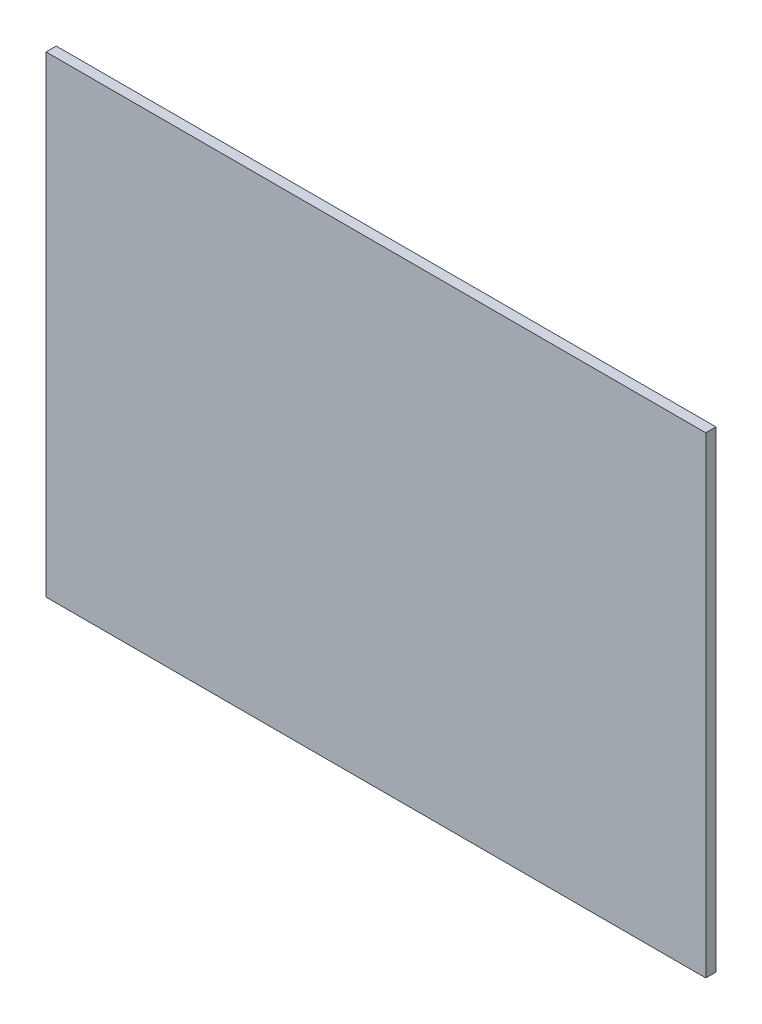
ISO-10303-21;
HEADER;
FILE_DESCRIPTION(('STEP AP214'),'2;1');
FILE_NAME('part.step','',(''),(''),'','','');
FILE_SCHEMA(('AUTOMOTIVE_DESIGN { 1 0 10303 214 1 1 1 1 }'));
ENDSEC;
DATA;
#1=APPLICATION_CONTEXT('core data for automotive mechanical design processes');
#2=APPLICATION_PROTOCOL_DEFINITION('international standard','automotive_design',2000,#1);
#3=PRODUCT_CONTEXT('',#1,'mechanical');
#4=PRODUCT('Part','Part','',(#3));
#5=PRODUCT_RELATED_PRODUCT_CATEGORY('part','',(#4));
#6=PRODUCT_DEFINITION_FORMATION('','',#4);
#7=PRODUCT_DEFINITION_CONTEXT('part definition',#1,'design');
#8=PRODUCT_DEFINITION('design','',#6,#7);
#9=PRODUCT_DEFINITION_SHAPE('','',#8);
#10=(LENGTH_UNIT() NAMED_UNIT(*) SI_UNIT(.MILLI.,.METRE.));
#11=(NAMED_UNIT(*) PLANE_ANGLE_UNIT() SI_UNIT($,.RADIAN.));
#12=(NAMED_UNIT(*) SI_UNIT($,.STERADIAN.) SOLID_ANGLE_UNIT());
#13=UNCERTAINTY_MEASURE_WITH_UNIT(LENGTH_MEASURE(1.E-05),#10,'distance_accuracy_value','');
#14=(GEOMETRIC_REPRESENTATION_CONTEXT(3) GLOBAL_UNCERTAINTY_ASSIGNED_CONTEXT((#13)) GLOBAL_UNIT_ASSIGNED_CONTEXT((#10,
#11,#12)) REPRESENTATION_CONTEXT('',''));
#15=CARTESIAN_POINT('',(0.,0.,0.));
#16=DIRECTION('',(0.,0.,1.));
#17=DIRECTION('',(1.,0.,0.));
#18=AXIS2_PLACEMENT_3D('',#15,#16,#17);
#19=CARTESIAN_POINT('',(-463.571428571428,251.785714285714,1.7));
#20=DIRECTION('',(1.,0.,0.));
#21=DIRECTION('',(0.,0.,-1.));
#22=AXIS2_PLACEMENT_3D('',#19,#20,#21);
#23=PLANE('',#22);
#24=DIRECTION('',(0.,-1.,0.));
#25=VECTOR('',#24,1.);
#26=CARTESIAN_POINT('',(-463.571428571428,251.785714285714,0.));
#27=LINE('',#26,#25);
#28=CARTESIAN_POINT('',(-463.571428571428,251.785714285714,0.));
#29=VERTEX_POINT('',#28);
#30=CARTESIAN_POINT('',(-463.571428571428,173.065714285714,0.));
#31=VERTEX_POINT('',#30);
#32=EDGE_CURVE('E107',#29,#31,#27,.T.);
#33=ORIENTED_EDGE('',*,*,#32,.T.);
#34=DIRECTION('',(0.,0.,-1.));
#35=VECTOR('',#34,1.);
#36=CARTESIAN_POINT('',(-463.571428571428,173.065714285714,1.7));
#37=LINE('',#36,#35);
#38=CARTESIAN_POINT('',(-463.571428571428,173.065714285714,1.7));
#39=VERTEX_POINT('',#38);
#40=EDGE_CURVE('E11',#39,#31,#37,.T.);
#41=ORIENTED_EDGE('',*,*,#40,.F.);
#42=DIRECTION('',(0.,-1.,0.));
#43=VECTOR('',#42,1.);
#44=CARTESIAN_POINT('',(-463.571428571428,251.785714285714,1.7));
#45=LINE('',#44,#43);
#46=CARTESIAN_POINT('',(-463.571428571428,251.785714285714,1.7));
#47=VERTEX_POINT('',#46);
#48=EDGE_CURVE('E91',#47,#39,#45,.T.);
#49=ORIENTED_EDGE('',*,*,#48,.F.);
#50=DIRECTION('',(0.,0.,-1.));
#51=VECTOR('',#50,1.);
#52=CARTESIAN_POINT('',(-463.571428571428,251.785714285714,1.7));
#53=LINE('',#52,#51);
#54=EDGE_CURVE('E103',#47,#29,#53,.T.);
#55=ORIENTED_EDGE('',*,*,#54,.T.);
#56=EDGE_LOOP('',(#33,#41,#49,#55));
#57=FACE_BOUND('',#56,.T.);
#58=ADVANCED_FACE('F39',(#57),#23,.F.);
#59=CARTESIAN_POINT('',(-463.571428571428,173.065714285714,1.7));
#60=DIRECTION('',(0.,1.,0.));
#61=DIRECTION('',(0.,0.,1.));
#62=AXIS2_PLACEMENT_3D('',#59,#60,#61);
#63=PLANE('',#62);
#64=DIRECTION('',(1.,0.,0.));
#65=VECTOR('',#64,1.);
#66=CARTESIAN_POINT('',(-463.571428571428,173.065714285714,0.));
#67=LINE('',#66,#65);
#68=CARTESIAN_POINT('',(-353.571428571428,173.065714285714,0.));
#69=VERTEX_POINT('',#68);
#70=EDGE_CURVE('E96',#31,#69,#67,.T.);
#71=ORIENTED_EDGE('',*,*,#70,.T.);
#72=DIRECTION('',(0.,0.,-1.));
#73=VECTOR('',#72,1.);
#74=CARTESIAN_POINT('',(-353.571428571428,173.065714285714,1.7));
#75=LINE('',#74,#73);
#76=CARTESIAN_POINT('',(-353.571428571428,173.065714285714,1.7));
#77=VERTEX_POINT('',#76);
#78=EDGE_CURVE('E48',#77,#69,#75,.T.);
#79=ORIENTED_EDGE('',*,*,#78,.F.);
#80=DIRECTION('',(1.,0.,0.));
#81=VECTOR('',#80,1.);
#82=CARTESIAN_POINT('',(-463.571428571428,173.065714285714,1.7));
#83=LINE('',#82,#81);
#84=EDGE_CURVE('E86',#39,#77,#83,.T.);
#85=ORIENTED_EDGE('',*,*,#84,.F.);
#86=ORIENTED_EDGE('',*,*,#40,.T.);
#87=EDGE_LOOP('',(#71,#79,#85,#86));
#88=FACE_BOUND('',#87,.T.);
#89=ADVANCED_FACE('F95',(#88),#63,.F.);
#90=CARTESIAN_POINT('',(-353.571428571428,251.785714285714,1.7));
#91=DIRECTION('',(-1.,0.,0.));
#92=DIRECTION('',(0.,0.,1.));
#93=AXIS2_PLACEMENT_3D('',#90,#91,#92);
#94=PLANE('',#93);
#95=DIRECTION('',(0.,1.,0.));
#96=VECTOR('',#95,1.);
#97=CARTESIAN_POINT('',(-353.571428571428,251.785714285714,0.));
#98=LINE('',#97,#96);
#99=CARTESIAN_POINT('',(-353.571428571428,251.785714285714,0.));
#100=VERTEX_POINT('',#99);
#101=EDGE_CURVE('E73',#69,#100,#98,.T.);
#102=ORIENTED_EDGE('',*,*,#101,.T.);
#103=DIRECTION('',(0.,0.,-1.));
#104=VECTOR('',#103,1.);
#105=CARTESIAN_POINT('',(-353.571428571428,251.785714285714,1.7));
#106=LINE('',#105,#104);
#107=CARTESIAN_POINT('',(-353.571428571428,251.785714285714,1.7));
#108=VERTEX_POINT('',#107);
#109=EDGE_CURVE('E98',#108,#100,#106,.T.);
#110=ORIENTED_EDGE('',*,*,#109,.F.);
#111=DIRECTION('',(0.,1.,0.));
#112=VECTOR('',#111,1.);
#113=CARTESIAN_POINT('',(-353.571428571428,251.785714285714,1.7));
#114=LINE('',#113,#112);
#115=EDGE_CURVE('E89',#77,#108,#114,.T.);
#116=ORIENTED_EDGE('',*,*,#115,.F.);
#117=ORIENTED_EDGE('',*,*,#78,.T.);
#118=EDGE_LOOP('',(#102,#110,#116,#117));
#119=FACE_BOUND('',#118,.T.);
#120=ADVANCED_FACE('F99',(#119),#94,.F.);
#121=CARTESIAN_POINT('',(-463.571428571428,251.785714285714,1.7));
#122=DIRECTION('',(0.,-1.,0.));
#123=DIRECTION('',(0.,0.,-1.));
#124=AXIS2_PLACEMENT_3D('',#121,#122,#123);
#125=PLANE('',#124);
#126=DIRECTION('',(-1.,0.,0.));
#127=VECTOR('',#126,1.);
#128=CARTESIAN_POINT('',(-463.571428571428,251.785714285714,0.));
#129=LINE('',#128,#127);
#130=EDGE_CURVE('E79',#100,#29,#129,.T.);
#131=ORIENTED_EDGE('',*,*,#130,.T.);
#132=ORIENTED_EDGE('',*,*,#54,.F.);
#133=DIRECTION('',(-1.,0.,0.));
#134=VECTOR('',#133,1.);
#135=CARTESIAN_POINT('',(-463.571428571428,251.785714285714,1.7));
#136=LINE('',#135,#134);
#137=EDGE_CURVE('E56',#108,#47,#136,.T.);
#138=ORIENTED_EDGE('',*,*,#137,.F.);
#139=ORIENTED_EDGE('',*,*,#109,.T.);
#140=EDGE_LOOP('',(#131,#132,#138,#139));
#141=FACE_BOUND('',#140,.T.);
#142=ADVANCED_FACE('F120',(#141),#125,.F.);
#143=CARTESIAN_POINT('',(0.,0.,1.7));
#144=DIRECTION('',(0.,0.,1.));
#145=DIRECTION('',(1.,0.,0.));
#146=AXIS2_PLACEMENT_3D('',#143,#144,#145);
#147=PLANE('',#146);
#148=ORIENTED_EDGE('',*,*,#48,.T.);
#149=ORIENTED_EDGE('',*,*,#84,.T.);
#150=ORIENTED_EDGE('',*,*,#115,.T.);
#151=ORIENTED_EDGE('',*,*,#137,.T.);
#152=EDGE_LOOP('',(#148,#149,#150,#151));
#153=FACE_BOUND('',#152,.T.);
#154=ADVANCED_FACE('F87',(#153),#147,.T.);
#155=CARTESIAN_POINT('',(0.,0.,0.));
#156=DIRECTION('',(0.,0.,1.));
#157=DIRECTION('',(1.,0.,0.));
#158=AXIS2_PLACEMENT_3D('',#155,#156,#157);
#159=PLANE('',#158);
#160=ORIENTED_EDGE('',*,*,#32,.F.);
#161=ORIENTED_EDGE('',*,*,#130,.F.);
#162=ORIENTED_EDGE('',*,*,#101,.F.);
#163=ORIENTED_EDGE('',*,*,#70,.F.);
#164=EDGE_LOOP('',(#160,#161,#162,#163));
#165=FACE_BOUND('',#164,.T.);
#166=ADVANCED_FACE('F123',(#165),#159,.F.);
#167=CLOSED_SHELL('',(#58,#89,#120,#142,#154,#166));
#168=MANIFOLD_SOLID_BREP('B2',#167);
#169=ADVANCED_BREP_SHAPE_REPRESENTATION('',(#18,#168),#14);
#170=SHAPE_DEFINITION_REPRESENTATION(#9,#169);
ENDSEC;
END-ISO-10303-21;
